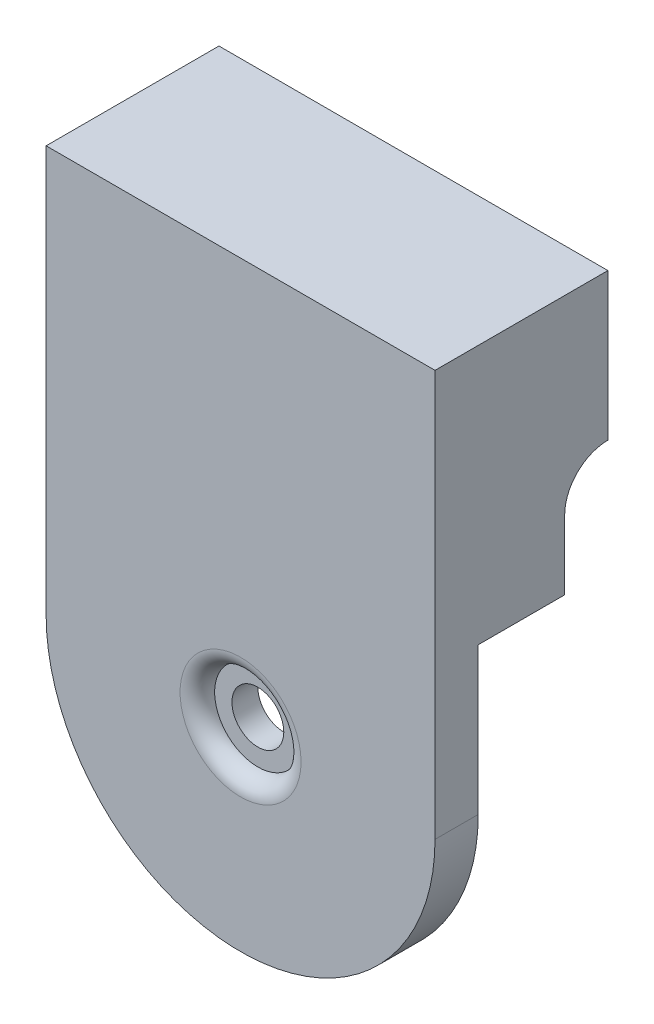
ISO-10303-21;
HEADER;
FILE_DESCRIPTION(('STEP AP214'),'2;1');
FILE_NAME('part.step','',(''),(''),'','','');
FILE_SCHEMA(('AUTOMOTIVE_DESIGN { 1 0 10303 214 1 1 1 1 }'));
ENDSEC;
DATA;
#1=APPLICATION_CONTEXT('core data for automotive mechanical design processes');
#2=APPLICATION_PROTOCOL_DEFINITION('international standard','automotive_design',2000,#1);
#3=PRODUCT_CONTEXT('',#1,'mechanical');
#4=PRODUCT('Part','Part','',(#3));
#5=PRODUCT_RELATED_PRODUCT_CATEGORY('part','',(#4));
#6=PRODUCT_DEFINITION_FORMATION('','',#4);
#7=PRODUCT_DEFINITION_CONTEXT('part definition',#1,'design');
#8=PRODUCT_DEFINITION('design','',#6,#7);
#9=PRODUCT_DEFINITION_SHAPE('','',#8);
#10=(LENGTH_UNIT() NAMED_UNIT(*) SI_UNIT(.MILLI.,.METRE.));
#11=(NAMED_UNIT(*) PLANE_ANGLE_UNIT() SI_UNIT($,.RADIAN.));
#12=(NAMED_UNIT(*) SI_UNIT($,.STERADIAN.) SOLID_ANGLE_UNIT());
#13=UNCERTAINTY_MEASURE_WITH_UNIT(LENGTH_MEASURE(1.E-05),#10,'distance_accuracy_value','');
#14=(GEOMETRIC_REPRESENTATION_CONTEXT(3) GLOBAL_UNCERTAINTY_ASSIGNED_CONTEXT((#13)) GLOBAL_UNIT_ASSIGNED_CONTEXT((#10,
#11,#12)) REPRESENTATION_CONTEXT('',''));
#15=CARTESIAN_POINT('',(0.,0.,0.));
#16=DIRECTION('',(0.,0.,1.));
#17=DIRECTION('',(1.,0.,0.));
#18=AXIS2_PLACEMENT_3D('',#15,#16,#17);
#19=CARTESIAN_POINT('',(-22.5,47.,-15.));
#20=DIRECTION('',(0.,0.,1.));
#21=DIRECTION('',(1.,0.,0.));
#22=AXIS2_PLACEMENT_3D('',#19,#20,#21);
#23=PLANE('',#22);
#24=DIRECTION('',(-1.,0.,0.));
#25=VECTOR('',#24,1.);
#26=CARTESIAN_POINT('',(-22.5,30.,-15.));
#27=LINE('',#26,#25);
#28=CARTESIAN_POINT('',(22.5,30.,-15.));
#29=VERTEX_POINT('',#28);
#30=CARTESIAN_POINT('',(-22.5,30.,-15.));
#31=VERTEX_POINT('',#30);
#32=EDGE_CURVE('E154',#29,#31,#27,.T.);
#33=ORIENTED_EDGE('',*,*,#32,.T.);
#34=DIRECTION('',(0.,-1.,0.));
#35=VECTOR('',#34,1.);
#36=CARTESIAN_POINT('',(-22.5,47.,-15.));
#37=LINE('',#36,#35);
#38=CARTESIAN_POINT('',(-22.5,47.,-15.));
#39=VERTEX_POINT('',#38);
#40=EDGE_CURVE('E171',#39,#31,#37,.T.);
#41=ORIENTED_EDGE('',*,*,#40,.F.);
#42=DIRECTION('',(-1.,0.,0.));
#43=VECTOR('',#42,1.);
#44=CARTESIAN_POINT('',(-22.5,47.,-15.));
#45=LINE('',#44,#43);
#46=CARTESIAN_POINT('',(22.5,47.,-15.));
#47=VERTEX_POINT('',#46);
#48=EDGE_CURVE('E167',#47,#39,#45,.T.);
#49=ORIENTED_EDGE('',*,*,#48,.F.);
#50=DIRECTION('',(0.,-1.,0.));
#51=VECTOR('',#50,1.);
#52=CARTESIAN_POINT('',(22.5,47.,-15.));
#53=LINE('',#52,#51);
#54=EDGE_CURVE('E174',#47,#29,#53,.T.);
#55=ORIENTED_EDGE('',*,*,#54,.T.);
#56=EDGE_LOOP('',(#33,#41,#49,#55));
#57=FACE_BOUND('',#56,.T.);
#58=DIRECTION('',(-1.,0.,0.));
#59=VECTOR('',#58,1.);
#60=CARTESIAN_POINT('',(15.25,41.75,-15.));
#61=LINE('',#60,#59);
#62=CARTESIAN_POINT('',(15.25,41.75,-15.));
#63=VERTEX_POINT('',#62);
#64=CARTESIAN_POINT('',(-15.25,41.75,-15.));
#65=VERTEX_POINT('',#64);
#66=EDGE_CURVE('E435',#63,#65,#61,.T.);
#67=ORIENTED_EDGE('',*,*,#66,.T.);
#68=DIRECTION('',(0.,-1.,0.));
#69=VECTOR('',#68,1.);
#70=CARTESIAN_POINT('',(-15.25,41.75,-15.));
#71=LINE('',#70,#69);
#72=CARTESIAN_POINT('',(-15.25,35.25,-15.));
#73=VERTEX_POINT('',#72);
#74=EDGE_CURVE('E153',#65,#73,#71,.T.);
#75=ORIENTED_EDGE('',*,*,#74,.T.);
#76=DIRECTION('',(-1.,0.,0.));
#77=VECTOR('',#76,1.);
#78=CARTESIAN_POINT('',(15.25,35.25,-15.));
#79=LINE('',#78,#77);
#80=CARTESIAN_POINT('',(15.25,35.25,-15.));
#81=VERTEX_POINT('',#80);
#82=EDGE_CURVE('E431',#81,#73,#79,.T.);
#83=ORIENTED_EDGE('',*,*,#82,.F.);
#84=DIRECTION('',(0.,-1.,0.));
#85=VECTOR('',#84,1.);
#86=CARTESIAN_POINT('',(15.25,41.75,-15.));
#87=LINE('',#86,#85);
#88=EDGE_CURVE('E149',#63,#81,#87,.T.);
#89=ORIENTED_EDGE('',*,*,#88,.F.);
#90=EDGE_LOOP('',(#67,#75,#83,#89));
#91=FACE_BOUND('',#90,.T.);
#92=ADVANCED_FACE('F39',(#57,#91),#23,.F.);
#93=CARTESIAN_POINT('',(0.,0.,0.));
#94=DIRECTION('',(0.,0.,1.));
#95=DIRECTION('',(1.,0.,0.));
#96=AXIS2_PLACEMENT_3D('',#93,#94,#95);
#97=PLANE('',#96);
#98=CARTESIAN_POINT('',(0.,0.,0.));
#99=DIRECTION('',(0.,0.,1.));
#100=DIRECTION('',(1.,0.,0.));
#101=AXIS2_PLACEMENT_3D('',#98,#99,#100);
#102=CIRCLE('',#101,3.);
#103=CARTESIAN_POINT('',(3.,0.,0.));
#104=VERTEX_POINT('',#103);
#105=EDGE_CURVE('E196',#104,#104,#102,.T.);
#106=ORIENTED_EDGE('',*,*,#105,.T.);
#107=EDGE_LOOP('',(#106));
#108=FACE_BOUND('',#107,.T.);
#109=DIRECTION('',(-1.,0.,0.));
#110=VECTOR('',#109,1.);
#111=CARTESIAN_POINT('',(22.5,17.,0.));
#112=LINE('',#111,#110);
#113=CARTESIAN_POINT('',(22.5,17.,0.));
#114=VERTEX_POINT('',#113);
#115=CARTESIAN_POINT('',(-22.5,17.,0.));
#116=VERTEX_POINT('',#115);
#117=EDGE_CURVE('E177',#114,#116,#112,.T.);
#118=ORIENTED_EDGE('',*,*,#117,.F.);
#119=DIRECTION('',(0.,1.,0.));
#120=VECTOR('',#119,1.);
#121=CARTESIAN_POINT('',(22.5,30.,0.));
#122=LINE('',#121,#120);
#123=CARTESIAN_POINT('',(22.5,0.,0.));
#124=VERTEX_POINT('',#123);
#125=EDGE_CURVE('E211',#124,#114,#122,.T.);
#126=ORIENTED_EDGE('',*,*,#125,.F.);
#127=CARTESIAN_POINT('',(0.,0.,0.));
#128=DIRECTION('',(0.,0.,1.));
#129=DIRECTION('',(1.,0.,0.));
#130=AXIS2_PLACEMENT_3D('',#127,#128,#129);
#131=CIRCLE('',#130,22.5);
#132=CARTESIAN_POINT('',(-22.5,0.,0.));
#133=VERTEX_POINT('',#132);
#134=EDGE_CURVE('E199',#133,#124,#131,.T.);
#135=ORIENTED_EDGE('',*,*,#134,.F.);
#136=DIRECTION('',(0.,-1.,0.));
#137=VECTOR('',#136,1.);
#138=CARTESIAN_POINT('',(-22.5,0.,0.));
#139=LINE('',#138,#137);
#140=EDGE_CURVE('E204',#116,#133,#139,.T.);
#141=ORIENTED_EDGE('',*,*,#140,.F.);
#142=EDGE_LOOP('',(#118,#126,#135,#141));
#143=FACE_BOUND('',#142,.T.);
#144=ADVANCED_FACE('F244',(#108,#143),#97,.F.);
#145=CARTESIAN_POINT('',(0.,0.,5.));
#146=DIRECTION('',(0.,0.,-1.));
#147=DIRECTION('',(-1.,0.,0.));
#148=AXIS2_PLACEMENT_3D('',#145,#146,#147);
#149=CYLINDRICAL_SURFACE('',#148,3.);
#150=ORIENTED_EDGE('',*,*,#105,.F.);
#151=EDGE_LOOP('',(#150));
#152=FACE_BOUND('',#151,.T.);
#153=CARTESIAN_POINT('',(0.,0.,3.));
#154=DIRECTION('',(0.,0.,1.));
#155=DIRECTION('',(1.,0.,0.));
#156=AXIS2_PLACEMENT_3D('',#153,#154,#155);
#157=CIRCLE('',#156,3.);
#158=CARTESIAN_POINT('',(3.,0.,3.));
#159=VERTEX_POINT('',#158);
#160=EDGE_CURVE('E195',#159,#159,#157,.T.);
#161=ORIENTED_EDGE('',*,*,#160,.T.);
#162=EDGE_LOOP('',(#161));
#163=FACE_BOUND('',#162,.T.);
#164=ADVANCED_FACE('F257',(#152,#163),#149,.F.);
#165=CARTESIAN_POINT('',(0.,0.,5.));
#166=DIRECTION('',(0.,0.,1.));
#167=DIRECTION('',(1.,0.,0.));
#168=AXIS2_PLACEMENT_3D('',#165,#166,#167);
#169=PLANE('',#168);
#170=CARTESIAN_POINT('',(0.,0.,5.));
#171=DIRECTION('',(0.,0.,1.));
#172=DIRECTION('',(1.,0.,0.));
#173=AXIS2_PLACEMENT_3D('',#170,#171,#172);
#174=CIRCLE('',#173,7.);
#175=CARTESIAN_POINT('',(7.,0.,5.));
#176=VERTEX_POINT('',#175);
#177=EDGE_CURVE('E11',#176,#176,#174,.F.);
#178=ORIENTED_EDGE('',*,*,#177,.T.);
#179=EDGE_LOOP('',(#178));
#180=FACE_BOUND('',#179,.T.);
#181=CARTESIAN_POINT('',(0.,0.,5.));
#182=DIRECTION('',(0.,0.,1.));
#183=DIRECTION('',(1.,0.,0.));
#184=AXIS2_PLACEMENT_3D('',#181,#182,#183);
#185=CIRCLE('',#184,22.5);
#186=CARTESIAN_POINT('',(-22.5,0.,5.));
#187=VERTEX_POINT('',#186);
#188=CARTESIAN_POINT('',(22.5,0.,5.));
#189=VERTEX_POINT('',#188);
#190=EDGE_CURVE('E200',#187,#189,#185,.T.);
#191=ORIENTED_EDGE('',*,*,#190,.T.);
#192=DIRECTION('',(0.,1.,0.));
#193=VECTOR('',#192,1.);
#194=CARTESIAN_POINT('',(22.5,30.,5.));
#195=LINE('',#194,#193);
#196=CARTESIAN_POINT('',(22.5,47.,5.));
#197=VERTEX_POINT('',#196);
#198=EDGE_CURVE('E203',#189,#197,#195,.T.);
#199=ORIENTED_EDGE('',*,*,#198,.T.);
#200=DIRECTION('',(1.,0.,0.));
#201=VECTOR('',#200,1.);
#202=CARTESIAN_POINT('',(22.5,47.,5.));
#203=LINE('',#202,#201);
#204=CARTESIAN_POINT('',(-22.5,47.,5.));
#205=VERTEX_POINT('',#204);
#206=EDGE_CURVE('E157',#205,#197,#203,.T.);
#207=ORIENTED_EDGE('',*,*,#206,.F.);
#208=DIRECTION('',(0.,-1.,0.));
#209=VECTOR('',#208,1.);
#210=CARTESIAN_POINT('',(-22.5,0.,5.));
#211=LINE('',#210,#209);
#212=EDGE_CURVE('E206',#205,#187,#211,.T.);
#213=ORIENTED_EDGE('',*,*,#212,.T.);
#214=EDGE_LOOP('',(#191,#199,#207,#213));
#215=FACE_BOUND('',#214,.T.);
#216=ADVANCED_FACE('F255',(#180,#215),#169,.T.);
#217=CARTESIAN_POINT('',(0.,0.,5.));
#218=DIRECTION('',(0.,0.,-1.));
#219=DIRECTION('',(-1.,0.,0.));
#220=AXIS2_PLACEMENT_3D('',#217,#218,#219);
#221=CYLINDRICAL_SURFACE('',#220,22.5);
#222=ORIENTED_EDGE('',*,*,#134,.T.);
#223=DIRECTION('',(0.,0.,-1.));
#224=VECTOR('',#223,1.);
#225=CARTESIAN_POINT('',(22.5,0.,5.));
#226=LINE('',#225,#224);
#227=EDGE_CURVE('E217',#189,#124,#226,.T.);
#228=ORIENTED_EDGE('',*,*,#227,.F.);
#229=ORIENTED_EDGE('',*,*,#190,.F.);
#230=DIRECTION('',(0.,0.,-1.));
#231=VECTOR('',#230,1.);
#232=CARTESIAN_POINT('',(-22.5,0.,5.));
#233=LINE('',#232,#231);
#234=EDGE_CURVE('E208',#187,#133,#233,.T.);
#235=ORIENTED_EDGE('',*,*,#234,.T.);
#236=EDGE_LOOP('',(#222,#228,#229,#235));
#237=FACE_BOUND('',#236,.T.);
#238=ADVANCED_FACE('F249',(#237),#221,.T.);
#239=CARTESIAN_POINT('',(22.5,30.,5.));
#240=DIRECTION('',(-1.,0.,0.));
#241=DIRECTION('',(0.,-1.,0.));
#242=AXIS2_PLACEMENT_3D('',#239,#240,#241);
#243=PLANE('',#242);
#244=ORIENTED_EDGE('',*,*,#125,.T.);
#245=DIRECTION('',(0.,0.,1.));
#246=VECTOR('',#245,1.);
#247=CARTESIAN_POINT('',(22.5,17.,-10.));
#248=LINE('',#247,#246);
#249=CARTESIAN_POINT('',(22.5,17.,-10.));
#250=VERTEX_POINT('',#249);
#251=EDGE_CURVE('E189',#250,#114,#248,.T.);
#252=ORIENTED_EDGE('',*,*,#251,.F.);
#253=DIRECTION('',(0.,-1.,0.));
#254=VECTOR('',#253,1.);
#255=CARTESIAN_POINT('',(22.5,30.,-10.));
#256=LINE('',#255,#254);
#257=CARTESIAN_POINT('',(22.5,25.,-10.));
#258=VERTEX_POINT('',#257);
#259=EDGE_CURVE('E178',#258,#250,#256,.T.);
#260=ORIENTED_EDGE('',*,*,#259,.F.);
#261=CARTESIAN_POINT('',(22.5,25.,-15.));
#262=DIRECTION('',(-1.,0.,0.));
#263=DIRECTION('',(0.,-1.,0.));
#264=AXIS2_PLACEMENT_3D('',#261,#262,#263);
#265=CIRCLE('',#264,5.);
#266=EDGE_CURVE('E61',#258,#29,#265,.T.);
#267=ORIENTED_EDGE('',*,*,#266,.T.);
#268=ORIENTED_EDGE('',*,*,#54,.F.);
#269=DIRECTION('',(0.,0.,-1.));
#270=VECTOR('',#269,1.);
#271=CARTESIAN_POINT('',(22.5,47.,-15.));
#272=LINE('',#271,#270);
#273=EDGE_CURVE('E165',#197,#47,#272,.T.);
#274=ORIENTED_EDGE('',*,*,#273,.F.);
#275=ORIENTED_EDGE('',*,*,#198,.F.);
#276=ORIENTED_EDGE('',*,*,#227,.T.);
#277=EDGE_LOOP('',(#244,#252,#260,#267,#268,#274,#275,#276));
#278=FACE_BOUND('',#277,.T.);
#279=ADVANCED_FACE('F227',(#278),#243,.F.);
#280=CARTESIAN_POINT('',(-22.5,0.,5.));
#281=DIRECTION('',(1.,0.,0.));
#282=DIRECTION('',(0.,0.,-1.));
#283=AXIS2_PLACEMENT_3D('',#280,#281,#282);
#284=PLANE('',#283);
#285=ORIENTED_EDGE('',*,*,#212,.F.);
#286=DIRECTION('',(0.,0.,1.));
#287=VECTOR('',#286,1.);
#288=CARTESIAN_POINT('',(-22.5,47.,5.));
#289=LINE('',#288,#287);
#290=EDGE_CURVE('E169',#39,#205,#289,.T.);
#291=ORIENTED_EDGE('',*,*,#290,.F.);
#292=ORIENTED_EDGE('',*,*,#40,.T.);
#293=CARTESIAN_POINT('',(-22.5,25.,-15.));
#294=DIRECTION('',(1.,0.,0.));
#295=DIRECTION('',(0.,0.,-1.));
#296=AXIS2_PLACEMENT_3D('',#293,#294,#295);
#297=CIRCLE('',#296,5.);
#298=CARTESIAN_POINT('',(-22.5,25.,-10.));
#299=VERTEX_POINT('',#298);
#300=EDGE_CURVE('E47',#31,#299,#297,.T.);
#301=ORIENTED_EDGE('',*,*,#300,.T.);
#302=DIRECTION('',(0.,1.,0.));
#303=VECTOR('',#302,1.);
#304=CARTESIAN_POINT('',(-22.5,17.,-10.));
#305=LINE('',#304,#303);
#306=CARTESIAN_POINT('',(-22.5,17.,-10.));
#307=VERTEX_POINT('',#306);
#308=EDGE_CURVE('E182',#307,#299,#305,.T.);
#309=ORIENTED_EDGE('',*,*,#308,.F.);
#310=DIRECTION('',(0.,0.,1.));
#311=VECTOR('',#310,1.);
#312=CARTESIAN_POINT('',(-22.5,17.,-10.));
#313=LINE('',#312,#311);
#314=EDGE_CURVE('E184',#307,#116,#313,.T.);
#315=ORIENTED_EDGE('',*,*,#314,.T.);
#316=ORIENTED_EDGE('',*,*,#140,.T.);
#317=ORIENTED_EDGE('',*,*,#234,.F.);
#318=EDGE_LOOP('',(#285,#291,#292,#301,#309,#315,#316,#317));
#319=FACE_BOUND('',#318,.T.);
#320=ADVANCED_FACE('F239',(#319),#284,.F.);
#321=CARTESIAN_POINT('',(0.,0.,3.));
#322=DIRECTION('',(0.,0.,1.));
#323=DIRECTION('',(1.,0.,0.));
#324=AXIS2_PLACEMENT_3D('',#321,#322,#323);
#325=PLANE('',#324);
#326=ORIENTED_EDGE('',*,*,#160,.F.);
#327=EDGE_LOOP('',(#326));
#328=FACE_BOUND('',#327,.T.);
#329=CARTESIAN_POINT('',(0.,0.,3.));
#330=DIRECTION('',(0.,0.,1.));
#331=DIRECTION('',(1.,0.,0.));
#332=AXIS2_PLACEMENT_3D('',#329,#330,#331);
#333=CIRCLE('',#332,5.);
#334=CARTESIAN_POINT('',(5.,0.,3.));
#335=VERTEX_POINT('',#334);
#336=EDGE_CURVE('E192',#335,#335,#333,.T.);
#337=ORIENTED_EDGE('',*,*,#336,.T.);
#338=EDGE_LOOP('',(#337));
#339=FACE_BOUND('',#338,.T.);
#340=ADVANCED_FACE('F285',(#328,#339),#325,.T.);
#341=CARTESIAN_POINT('',(22.5,17.,-10.));
#342=DIRECTION('',(0.,1.,0.));
#343=DIRECTION('',(0.,0.,1.));
#344=AXIS2_PLACEMENT_3D('',#341,#342,#343);
#345=PLANE('',#344);
#346=ORIENTED_EDGE('',*,*,#117,.T.);
#347=ORIENTED_EDGE('',*,*,#314,.F.);
#348=DIRECTION('',(-1.,0.,0.));
#349=VECTOR('',#348,1.);
#350=CARTESIAN_POINT('',(22.5,17.,-10.));
#351=LINE('',#350,#349);
#352=EDGE_CURVE('E180',#250,#307,#351,.T.);
#353=ORIENTED_EDGE('',*,*,#352,.F.);
#354=ORIENTED_EDGE('',*,*,#251,.T.);
#355=EDGE_LOOP('',(#346,#347,#353,#354));
#356=FACE_BOUND('',#355,.T.);
#357=ADVANCED_FACE('F242',(#356),#345,.F.);
#358=CARTESIAN_POINT('',(0.,0.,-10.));
#359=DIRECTION('',(0.,0.,-1.));
#360=DIRECTION('',(-1.,0.,0.));
#361=AXIS2_PLACEMENT_3D('',#358,#359,#360);
#362=PLANE('',#361);
#363=ORIENTED_EDGE('',*,*,#308,.T.);
#364=DIRECTION('',(1.,0.,0.));
#365=VECTOR('',#364,1.);
#366=CARTESIAN_POINT('',(22.5,25.,-10.));
#367=LINE('',#366,#365);
#368=EDGE_CURVE('E220',#299,#258,#367,.T.);
#369=ORIENTED_EDGE('',*,*,#368,.T.);
#370=ORIENTED_EDGE('',*,*,#259,.T.);
#371=ORIENTED_EDGE('',*,*,#352,.T.);
#372=EDGE_LOOP('',(#363,#369,#370,#371));
#373=FACE_BOUND('',#372,.T.);
#374=ADVANCED_FACE('F236',(#373),#362,.T.);
#375=CARTESIAN_POINT('',(0.,47.,0.));
#376=DIRECTION('',(0.,-1.,0.));
#377=DIRECTION('',(0.,0.,-1.));
#378=AXIS2_PLACEMENT_3D('',#375,#376,#377);
#379=PLANE('',#378);
#380=ORIENTED_EDGE('',*,*,#206,.T.);
#381=ORIENTED_EDGE('',*,*,#273,.T.);
#382=ORIENTED_EDGE('',*,*,#48,.T.);
#383=ORIENTED_EDGE('',*,*,#290,.T.);
#384=EDGE_LOOP('',(#380,#381,#382,#383));
#385=FACE_BOUND('',#384,.T.);
#386=ADVANCED_FACE('F254',(#385),#379,.F.);
#387=CARTESIAN_POINT('',(15.25,41.75,0.));
#388=DIRECTION('',(0.,-1.,0.));
#389=DIRECTION('',(1.,0.,0.));
#390=AXIS2_PLACEMENT_3D('',#387,#388,#389);
#391=PLANE('',#390);
#392=ORIENTED_EDGE('',*,*,#66,.F.);
#393=DIRECTION('',(0.,0.,-1.));
#394=VECTOR('',#393,1.);
#395=CARTESIAN_POINT('',(15.25,41.75,0.));
#396=LINE('',#395,#394);
#397=CARTESIAN_POINT('',(15.25,41.75,0.));
#398=VERTEX_POINT('',#397);
#399=EDGE_CURVE('E148',#398,#63,#396,.T.);
#400=ORIENTED_EDGE('',*,*,#399,.F.);
#401=DIRECTION('',(-1.,0.,0.));
#402=VECTOR('',#401,1.);
#403=CARTESIAN_POINT('',(15.25,41.75,0.));
#404=LINE('',#403,#402);
#405=CARTESIAN_POINT('',(-15.25,41.75,0.));
#406=VERTEX_POINT('',#405);
#407=EDGE_CURVE('E134',#398,#406,#404,.T.);
#408=ORIENTED_EDGE('',*,*,#407,.T.);
#409=DIRECTION('',(0.,0.,-1.));
#410=VECTOR('',#409,1.);
#411=CARTESIAN_POINT('',(-15.25,41.75,0.));
#412=LINE('',#411,#410);
#413=EDGE_CURVE('E145',#406,#65,#412,.T.);
#414=ORIENTED_EDGE('',*,*,#413,.T.);
#415=EDGE_LOOP('',(#392,#400,#408,#414));
#416=FACE_BOUND('',#415,.T.);
#417=ADVANCED_FACE('F144',(#416),#391,.T.);
#418=CARTESIAN_POINT('',(-15.25,41.75,0.));
#419=DIRECTION('',(1.,0.,0.));
#420=DIRECTION('',(0.,0.,-1.));
#421=AXIS2_PLACEMENT_3D('',#418,#419,#420);
#422=PLANE('',#421);
#423=ORIENTED_EDGE('',*,*,#74,.F.);
#424=ORIENTED_EDGE('',*,*,#413,.F.);
#425=DIRECTION('',(0.,-1.,0.));
#426=VECTOR('',#425,1.);
#427=CARTESIAN_POINT('',(-15.25,41.75,0.));
#428=LINE('',#427,#426);
#429=CARTESIAN_POINT('',(-15.25,35.25,0.));
#430=VERTEX_POINT('',#429);
#431=EDGE_CURVE('E130',#406,#430,#428,.T.);
#432=ORIENTED_EDGE('',*,*,#431,.T.);
#433=DIRECTION('',(0.,0.,-1.));
#434=VECTOR('',#433,1.);
#435=CARTESIAN_POINT('',(-15.25,35.25,0.));
#436=LINE('',#435,#434);
#437=EDGE_CURVE('E155',#430,#73,#436,.T.);
#438=ORIENTED_EDGE('',*,*,#437,.T.);
#439=EDGE_LOOP('',(#423,#424,#432,#438));
#440=FACE_BOUND('',#439,.T.);
#441=ADVANCED_FACE('F151',(#440),#422,.T.);
#442=CARTESIAN_POINT('',(15.25,35.25,0.));
#443=DIRECTION('',(0.,-1.,0.));
#444=DIRECTION('',(0.,0.,-1.));
#445=AXIS2_PLACEMENT_3D('',#442,#443,#444);
#446=PLANE('',#445);
#447=ORIENTED_EDGE('',*,*,#82,.T.);
#448=ORIENTED_EDGE('',*,*,#437,.F.);
#449=DIRECTION('',(-1.,0.,0.));
#450=VECTOR('',#449,1.);
#451=CARTESIAN_POINT('',(15.25,35.25,0.));
#452=LINE('',#451,#450);
#453=CARTESIAN_POINT('',(15.25,35.25,0.));
#454=VERTEX_POINT('',#453);
#455=EDGE_CURVE('E137',#454,#430,#452,.T.);
#456=ORIENTED_EDGE('',*,*,#455,.F.);
#457=DIRECTION('',(0.,0.,-1.));
#458=VECTOR('',#457,1.);
#459=CARTESIAN_POINT('',(15.25,35.25,0.));
#460=LINE('',#459,#458);
#461=EDGE_CURVE('E159',#454,#81,#460,.T.);
#462=ORIENTED_EDGE('',*,*,#461,.T.);
#463=EDGE_LOOP('',(#447,#448,#456,#462));
#464=FACE_BOUND('',#463,.T.);
#465=ADVANCED_FACE('F386',(#464),#446,.F.);
#466=CARTESIAN_POINT('',(15.25,41.75,0.));
#467=DIRECTION('',(1.,0.,0.));
#468=DIRECTION('',(0.,0.,-1.));
#469=AXIS2_PLACEMENT_3D('',#466,#467,#468);
#470=PLANE('',#469);
#471=ORIENTED_EDGE('',*,*,#88,.T.);
#472=ORIENTED_EDGE('',*,*,#461,.F.);
#473=DIRECTION('',(0.,-1.,0.));
#474=VECTOR('',#473,1.);
#475=CARTESIAN_POINT('',(15.25,41.75,0.));
#476=LINE('',#475,#474);
#477=EDGE_CURVE('E439',#398,#454,#476,.T.);
#478=ORIENTED_EDGE('',*,*,#477,.F.);
#479=ORIENTED_EDGE('',*,*,#399,.T.);
#480=EDGE_LOOP('',(#471,#472,#478,#479));
#481=FACE_BOUND('',#480,.T.);
#482=ADVANCED_FACE('F302',(#481),#470,.F.);
#483=CARTESIAN_POINT('',(0.,0.,0.));
#484=DIRECTION('',(0.,0.,1.));
#485=DIRECTION('',(1.,0.,0.));
#486=AXIS2_PLACEMENT_3D('',#483,#484,#485);
#487=PLANE('',#486);
#488=ORIENTED_EDGE('',*,*,#407,.F.);
#489=ORIENTED_EDGE('',*,*,#477,.T.);
#490=ORIENTED_EDGE('',*,*,#455,.T.);
#491=ORIENTED_EDGE('',*,*,#431,.F.);
#492=EDGE_LOOP('',(#488,#489,#490,#491));
#493=FACE_BOUND('',#492,.T.);
#494=ADVANCED_FACE('F132',(#493),#487,.F.);
#495=CARTESIAN_POINT('',(0.,25.,-15.));
#496=DIRECTION('',(-1.,0.,0.));
#497=DIRECTION('',(0.,0.,1.));
#498=AXIS2_PLACEMENT_3D('',#495,#496,#497);
#499=CYLINDRICAL_SURFACE('',#498,5.);
#500=ORIENTED_EDGE('',*,*,#300,.F.);
#501=ORIENTED_EDGE('',*,*,#32,.F.);
#502=ORIENTED_EDGE('',*,*,#266,.F.);
#503=ORIENTED_EDGE('',*,*,#368,.F.);
#504=EDGE_LOOP('',(#500,#501,#502,#503));
#505=FACE_BOUND('',#504,.T.);
#506=ADVANCED_FACE('F234',(#505),#499,.F.);
#507=CARTESIAN_POINT('',(0.,0.,3.));
#508=DIRECTION('',(0.,0.,1.));
#509=DIRECTION('',(1.,0.,0.));
#510=AXIS2_PLACEMENT_3D('',#507,#508,#509);
#511=TOROIDAL_SURFACE('',#510,7.,2.);
#512=ORIENTED_EDGE('',*,*,#177,.F.);
#513=EDGE_LOOP('',(#512));
#514=FACE_BOUND('',#513,.T.);
#515=ORIENTED_EDGE('',*,*,#336,.F.);
#516=EDGE_LOOP('',(#515));
#517=FACE_BOUND('',#516,.T.);
#518=ADVANCED_FACE('F41',(#514,#517),#511,.T.);
#519=CLOSED_SHELL('',(#92,#144,#164,#216,#238,#279,#320,#340,#357,#374,#386,#417,#441,#465,#482,
#494,#506,#518));
#520=MANIFOLD_SOLID_BREP('B2',#519);
#521=ADVANCED_BREP_SHAPE_REPRESENTATION('',(#18,#520),#14);
#522=SHAPE_DEFINITION_REPRESENTATION(#9,#521);
ENDSEC;
END-ISO-10303-21;
